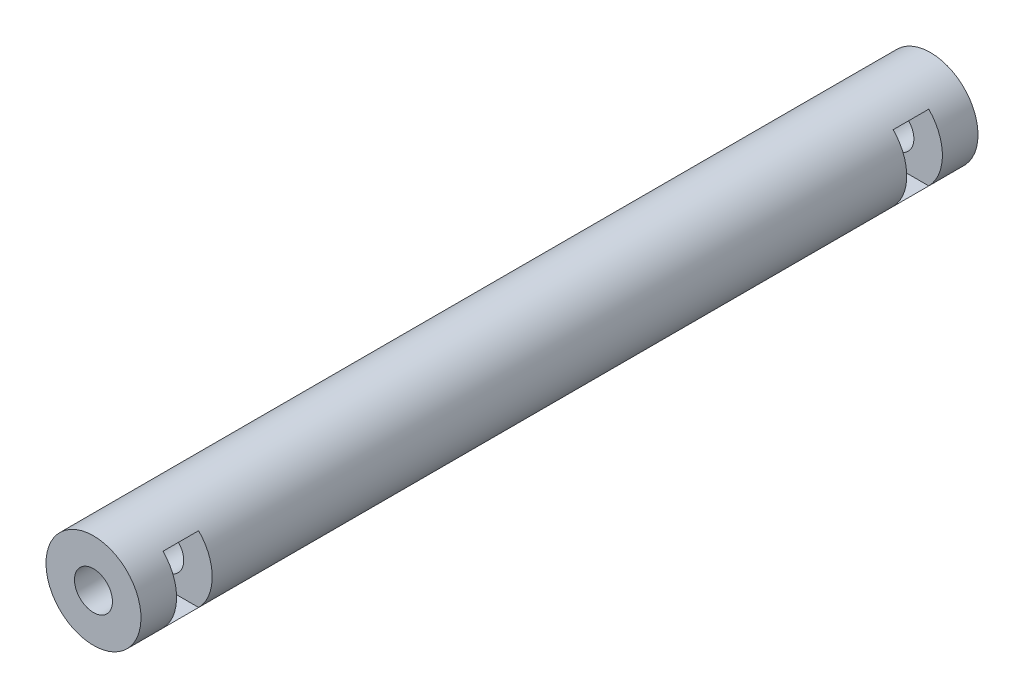
ISO-10303-21;
HEADER;
FILE_DESCRIPTION(('STEP AP214'),'2;1');
FILE_NAME('part.step','',(''),(''),'','','');
FILE_SCHEMA(('AUTOMOTIVE_DESIGN { 1 0 10303 214 1 1 1 1 }'));
ENDSEC;
DATA;
#1=APPLICATION_CONTEXT('core data for automotive mechanical design processes');
#2=APPLICATION_PROTOCOL_DEFINITION('international standard','automotive_design',2000,#1);
#3=PRODUCT_CONTEXT('',#1,'mechanical');
#4=PRODUCT('Part','Part','',(#3));
#5=PRODUCT_RELATED_PRODUCT_CATEGORY('part','',(#4));
#6=PRODUCT_DEFINITION_FORMATION('','',#4);
#7=PRODUCT_DEFINITION_CONTEXT('part definition',#1,'design');
#8=PRODUCT_DEFINITION('design','',#6,#7);
#9=PRODUCT_DEFINITION_SHAPE('','',#8);
#10=(LENGTH_UNIT() NAMED_UNIT(*) SI_UNIT(.MILLI.,.METRE.));
#11=(NAMED_UNIT(*) PLANE_ANGLE_UNIT() SI_UNIT($,.RADIAN.));
#12=(NAMED_UNIT(*) SI_UNIT($,.STERADIAN.) SOLID_ANGLE_UNIT());
#13=UNCERTAINTY_MEASURE_WITH_UNIT(LENGTH_MEASURE(1.E-05),#10,'distance_accuracy_value','');
#14=(GEOMETRIC_REPRESENTATION_CONTEXT(3) GLOBAL_UNCERTAINTY_ASSIGNED_CONTEXT((#13)) GLOBAL_UNIT_ASSIGNED_CONTEXT((#10,
#11,#12)) REPRESENTATION_CONTEXT('',''));
#15=CARTESIAN_POINT('',(0.,0.,0.));
#16=DIRECTION('',(0.,0.,1.));
#17=DIRECTION('',(1.,0.,0.));
#18=AXIS2_PLACEMENT_3D('',#15,#16,#17);
#19=CARTESIAN_POINT('',(2.,37.,70.4916798842214));
#20=DIRECTION('',(0.,0.,-1.));
#21=DIRECTION('',(-1.,0.,0.));
#22=AXIS2_PLACEMENT_3D('',#19,#20,#21);
#23=CYLINDRICAL_SURFACE('',#22,1.6);
#24=CARTESIAN_POINT('',(2.,37.,5.99999999999999));
#25=DIRECTION('',(0.,0.,1.));
#26=DIRECTION('',(1.,0.,0.));
#27=AXIS2_PLACEMENT_3D('',#24,#25,#26);
#28=CIRCLE('',#27,1.6);
#29=CARTESIAN_POINT('',(3.59999999999999,37.,5.99999999999999));
#30=VERTEX_POINT('',#29);
#31=EDGE_CURVE('E144',#30,#30,#28,.F.);
#32=ORIENTED_EDGE('',*,*,#31,.T.);
#33=EDGE_LOOP('',(#32));
#34=FACE_BOUND('',#33,.T.);
#35=CARTESIAN_POINT('',(2.,37.,64.4916798842214));
#36=DIRECTION('',(0.,0.,1.));
#37=DIRECTION('',(0.,-1.,0.));
#38=AXIS2_PLACEMENT_3D('',#35,#36,#37);
#39=CIRCLE('',#38,1.6);
#40=CARTESIAN_POINT('',(2.,35.4,64.4916798842214));
#41=VERTEX_POINT('',#40);
#42=EDGE_CURVE('E121',#41,#41,#39,.F.);
#43=ORIENTED_EDGE('',*,*,#42,.F.);
#44=EDGE_LOOP('',(#43));
#45=FACE_BOUND('',#44,.T.);
#46=ADVANCED_FACE('F33',(#34,#45),#23,.F.);
#47=CARTESIAN_POINT('',(2.,37.,70.4916798842214));
#48=DIRECTION('',(0.,0.,-1.));
#49=DIRECTION('',(-1.,0.,0.));
#50=AXIS2_PLACEMENT_3D('',#47,#48,#49);
#51=CIRCLE('',#50,1.6);
#52=CARTESIAN_POINT('',(0.400000000000001,37.,70.4916798842214));
#53=VERTEX_POINT('',#52);
#54=EDGE_CURVE('E145',#53,#53,#51,.T.);
#55=ORIENTED_EDGE('',*,*,#54,.F.);
#56=EDGE_LOOP('',(#55));
#57=FACE_BOUND('',#56,.T.);
#58=CARTESIAN_POINT('',(2.,37.,67.4916798842214));
#59=DIRECTION('',(0.,0.,-1.));
#60=DIRECTION('',(0.,1.,0.));
#61=AXIS2_PLACEMENT_3D('',#58,#59,#60);
#62=CIRCLE('',#61,1.6);
#63=CARTESIAN_POINT('',(2.,38.6,67.4916798842214));
#64=VERTEX_POINT('',#63);
#65=EDGE_CURVE('E118',#64,#64,#62,.F.);
#66=ORIENTED_EDGE('',*,*,#65,.F.);
#67=EDGE_LOOP('',(#66));
#68=FACE_BOUND('',#67,.T.);
#69=ADVANCED_FACE('F187',(#57,#68),#23,.F.);
#70=CARTESIAN_POINT('',(2.,37.,81.8053883832062));
#71=DIRECTION('',(0.,0.,-1.));
#72=DIRECTION('',(-1.,0.,0.));
#73=AXIS2_PLACEMENT_3D('',#70,#71,#72);
#74=CYLINDRICAL_SURFACE('',#73,4.);
#75=CARTESIAN_POINT('',(2.,37.,67.4916798842214));
#76=DIRECTION('',(0.,0.,-1.));
#77=DIRECTION('',(0.,1.,0.));
#78=AXIS2_PLACEMENT_3D('',#75,#76,#77);
#79=CIRCLE('',#78,4.);
#80=CARTESIAN_POINT('',(-0.856571371417151,34.2,67.4916798842214));
#81=VERTEX_POINT('',#80);
#82=CARTESIAN_POINT('',(-0.856571371417151,39.8,67.4916798842214));
#83=VERTEX_POINT('',#82);
#84=EDGE_CURVE('E106',#81,#83,#79,.T.);
#85=ORIENTED_EDGE('',*,*,#84,.F.);
#86=DIRECTION('',(0.,0.,-1.));
#87=VECTOR('',#86,1.);
#88=CARTESIAN_POINT('',(-0.856571371417151,34.2,81.8053883832062));
#89=LINE('',#88,#87);
#90=CARTESIAN_POINT('',(-0.856571371417151,34.2,64.4916798842214));
#91=VERTEX_POINT('',#90);
#92=EDGE_CURVE('E102',#91,#81,#89,.F.);
#93=ORIENTED_EDGE('',*,*,#92,.F.);
#94=CARTESIAN_POINT('',(2.,37.,64.4916798842214));
#95=DIRECTION('',(0.,0.,1.));
#96=DIRECTION('',(0.,-1.,0.));
#97=AXIS2_PLACEMENT_3D('',#94,#95,#96);
#98=CIRCLE('',#97,4.);
#99=CARTESIAN_POINT('',(-0.856571371417151,39.8,64.4916798842214));
#100=VERTEX_POINT('',#99);
#101=EDGE_CURVE('E43',#100,#91,#98,.T.);
#102=ORIENTED_EDGE('',*,*,#101,.F.);
#103=DIRECTION('',(0.,0.,-1.));
#104=VECTOR('',#103,1.);
#105=CARTESIAN_POINT('',(-0.856571371417151,39.8,81.8053883832062));
#106=LINE('',#105,#104);
#107=EDGE_CURVE('E100',#83,#100,#106,.T.);
#108=ORIENTED_EDGE('',*,*,#107,.F.);
#109=EDGE_LOOP('',(#85,#93,#102,#108));
#110=FACE_BOUND('',#109,.T.);
#111=CARTESIAN_POINT('',(2.,37.,0.));
#112=DIRECTION('',(0.,0.,1.));
#113=DIRECTION('',(1.,0.,0.));
#114=AXIS2_PLACEMENT_3D('',#111,#112,#113);
#115=CIRCLE('',#114,4.);
#116=CARTESIAN_POINT('',(6.,37.,0.));
#117=VERTEX_POINT('',#116);
#118=EDGE_CURVE('E151',#117,#117,#115,.T.);
#119=ORIENTED_EDGE('',*,*,#118,.T.);
#120=EDGE_LOOP('',(#119));
#121=FACE_BOUND('',#120,.T.);
#122=CARTESIAN_POINT('',(2.,37.,70.4916798842214));
#123=DIRECTION('',(0.,0.,-1.));
#124=DIRECTION('',(0.,1.,0.));
#125=AXIS2_PLACEMENT_3D('',#122,#123,#124);
#126=CIRCLE('',#125,4.);
#127=CARTESIAN_POINT('',(2.,41.,70.4916798842214));
#128=VERTEX_POINT('',#127);
#129=EDGE_CURVE('E154',#128,#128,#126,.T.);
#130=ORIENTED_EDGE('',*,*,#129,.T.);
#131=EDGE_LOOP('',(#130));
#132=FACE_BOUND('',#131,.T.);
#133=DIRECTION('',(0.,0.,-1.));
#134=VECTOR('',#133,1.);
#135=CARTESIAN_POINT('',(-0.856571371417151,39.8,81.8053883832062));
#136=LINE('',#135,#134);
#137=CARTESIAN_POINT('',(-0.856571371417151,39.8,3.));
#138=VERTEX_POINT('',#137);
#139=CARTESIAN_POINT('',(-0.856571371417151,39.8,6.));
#140=VERTEX_POINT('',#139);
#141=EDGE_CURVE('E170',#138,#140,#136,.F.);
#142=ORIENTED_EDGE('',*,*,#141,.T.);
#143=CARTESIAN_POINT('',(2.,37.,5.99999999999999));
#144=DIRECTION('',(0.,0.,1.));
#145=DIRECTION('',(1.,0.,0.));
#146=AXIS2_PLACEMENT_3D('',#143,#144,#145);
#147=CIRCLE('',#146,4.);
#148=CARTESIAN_POINT('',(-0.856571371417151,34.2,6.));
#149=VERTEX_POINT('',#148);
#150=EDGE_CURVE('E143',#140,#149,#147,.T.);
#151=ORIENTED_EDGE('',*,*,#150,.T.);
#152=DIRECTION('',(0.,0.,-1.));
#153=VECTOR('',#152,1.);
#154=CARTESIAN_POINT('',(-0.856571371417151,34.2,81.8053883832062));
#155=LINE('',#154,#153);
#156=CARTESIAN_POINT('',(-0.856571371417151,34.2,3.));
#157=VERTEX_POINT('',#156);
#158=EDGE_CURVE('E157',#149,#157,#155,.T.);
#159=ORIENTED_EDGE('',*,*,#158,.T.);
#160=CARTESIAN_POINT('',(2.,37.,3.));
#161=DIRECTION('',(0.,0.,-1.));
#162=DIRECTION('',(-1.,0.,0.));
#163=AXIS2_PLACEMENT_3D('',#160,#161,#162);
#164=CIRCLE('',#163,4.);
#165=EDGE_CURVE('E137',#157,#138,#164,.T.);
#166=ORIENTED_EDGE('',*,*,#165,.T.);
#167=EDGE_LOOP('',(#142,#151,#159,#166));
#168=FACE_BOUND('',#167,.T.);
#169=DIRECTION('',(0.,0.,-1.));
#170=VECTOR('',#169,1.);
#171=CARTESIAN_POINT('',(4.85657137141714,34.2,81.8053883832062));
#172=LINE('',#171,#170);
#173=CARTESIAN_POINT('',(4.85657137141714,34.2,3.));
#174=VERTEX_POINT('',#173);
#175=CARTESIAN_POINT('',(4.85657137141714,34.2,5.99999999999999));
#176=VERTEX_POINT('',#175);
#177=EDGE_CURVE('E164',#174,#176,#172,.F.);
#178=ORIENTED_EDGE('',*,*,#177,.T.);
#179=CARTESIAN_POINT('',(4.85657137141714,39.8,6.));
#180=VERTEX_POINT('',#179);
#181=EDGE_CURVE('E140',#176,#180,#147,.T.);
#182=ORIENTED_EDGE('',*,*,#181,.T.);
#183=DIRECTION('',(0.,0.,-1.));
#184=VECTOR('',#183,1.);
#185=CARTESIAN_POINT('',(4.85657137141714,39.8,81.8053883832062));
#186=LINE('',#185,#184);
#187=CARTESIAN_POINT('',(4.85657137141714,39.8,3.));
#188=VERTEX_POINT('',#187);
#189=EDGE_CURVE('E167',#180,#188,#186,.T.);
#190=ORIENTED_EDGE('',*,*,#189,.T.);
#191=EDGE_CURVE('E139',#188,#174,#164,.T.);
#192=ORIENTED_EDGE('',*,*,#191,.T.);
#193=EDGE_LOOP('',(#178,#182,#190,#192));
#194=FACE_BOUND('',#193,.T.);
#195=CARTESIAN_POINT('',(4.85657137141714,34.2,64.4916798842214));
#196=VERTEX_POINT('',#195);
#197=CARTESIAN_POINT('',(4.85657137141714,39.8,64.4916798842214));
#198=VERTEX_POINT('',#197);
#199=EDGE_CURVE('E11',#196,#198,#98,.T.);
#200=ORIENTED_EDGE('',*,*,#199,.F.);
#201=DIRECTION('',(0.,0.,-1.));
#202=VECTOR('',#201,1.);
#203=CARTESIAN_POINT('',(4.85657137141714,34.2,81.8053883832062));
#204=LINE('',#203,#202);
#205=CARTESIAN_POINT('',(4.85657137141714,34.2,67.4916798842214));
#206=VERTEX_POINT('',#205);
#207=EDGE_CURVE('E37',#206,#196,#204,.T.);
#208=ORIENTED_EDGE('',*,*,#207,.F.);
#209=CARTESIAN_POINT('',(4.85657137141714,39.8,67.4916798842214));
#210=VERTEX_POINT('',#209);
#211=EDGE_CURVE('E173',#210,#206,#79,.T.);
#212=ORIENTED_EDGE('',*,*,#211,.F.);
#213=DIRECTION('',(0.,0.,-1.));
#214=VECTOR('',#213,1.);
#215=CARTESIAN_POINT('',(4.85657137141714,39.8,81.8053883832062));
#216=LINE('',#215,#214);
#217=EDGE_CURVE('E175',#198,#210,#216,.F.);
#218=ORIENTED_EDGE('',*,*,#217,.F.);
#219=EDGE_LOOP('',(#200,#208,#212,#218));
#220=FACE_BOUND('',#219,.T.);
#221=ADVANCED_FACE('F35',(#110,#121,#132,#168,#194,#220),#74,.T.);
#222=CARTESIAN_POINT('',(2.,37.,0.));
#223=DIRECTION('',(0.,0.,1.));
#224=DIRECTION('',(1.,0.,0.));
#225=AXIS2_PLACEMENT_3D('',#222,#223,#224);
#226=PLANE('',#225);
#227=CARTESIAN_POINT('',(2.,37.,0.));
#228=DIRECTION('',(0.,0.,1.));
#229=DIRECTION('',(1.,0.,0.));
#230=AXIS2_PLACEMENT_3D('',#227,#228,#229);
#231=CIRCLE('',#230,1.6);
#232=CARTESIAN_POINT('',(3.59999999999999,37.,0.));
#233=VERTEX_POINT('',#232);
#234=EDGE_CURVE('E148',#233,#233,#231,.T.);
#235=ORIENTED_EDGE('',*,*,#234,.T.);
#236=EDGE_LOOP('',(#235));
#237=FACE_BOUND('',#236,.T.);
#238=ORIENTED_EDGE('',*,*,#118,.F.);
#239=EDGE_LOOP('',(#238));
#240=FACE_BOUND('',#239,.T.);
#241=ADVANCED_FACE('F186',(#237,#240),#226,.F.);
#242=CARTESIAN_POINT('',(0.,0.,70.4916798842214));
#243=DIRECTION('',(0.,0.,-1.));
#244=DIRECTION('',(-1.,0.,0.));
#245=AXIS2_PLACEMENT_3D('',#242,#243,#244);
#246=PLANE('',#245);
#247=ORIENTED_EDGE('',*,*,#54,.T.);
#248=EDGE_LOOP('',(#247));
#249=FACE_BOUND('',#248,.T.);
#250=ORIENTED_EDGE('',*,*,#129,.F.);
#251=EDGE_LOOP('',(#250));
#252=FACE_BOUND('',#251,.T.);
#253=ADVANCED_FACE('F192',(#249,#252),#246,.F.);
#254=CARTESIAN_POINT('',(2.,37.,3.));
#255=DIRECTION('',(0.,0.,-1.));
#256=DIRECTION('',(-1.,0.,0.));
#257=AXIS2_PLACEMENT_3D('',#254,#255,#256);
#258=CIRCLE('',#257,1.6);
#259=CARTESIAN_POINT('',(0.400000000000001,37.,3.));
#260=VERTEX_POINT('',#259);
#261=EDGE_CURVE('E129',#260,#260,#258,.F.);
#262=ORIENTED_EDGE('',*,*,#261,.T.);
#263=EDGE_LOOP('',(#262));
#264=FACE_BOUND('',#263,.T.);
#265=ORIENTED_EDGE('',*,*,#234,.F.);
#266=EDGE_LOOP('',(#265));
#267=FACE_BOUND('',#266,.T.);
#268=ADVANCED_FACE('F196',(#264,#267),#23,.F.);
#269=CARTESIAN_POINT('',(-2.00000000000001,39.8,6.));
#270=DIRECTION('',(0.,1.,0.));
#271=DIRECTION('',(0.,0.,1.));
#272=AXIS2_PLACEMENT_3D('',#269,#270,#271);
#273=PLANE('',#272);
#274=DIRECTION('',(1.,0.,0.));
#275=VECTOR('',#274,1.);
#276=CARTESIAN_POINT('',(-2.00000000000001,39.8,6.));
#277=LINE('',#276,#275);
#278=EDGE_CURVE('E126',#140,#180,#277,.T.);
#279=ORIENTED_EDGE('',*,*,#278,.F.);
#280=ORIENTED_EDGE('',*,*,#141,.F.);
#281=DIRECTION('',(1.,0.,0.));
#282=VECTOR('',#281,1.);
#283=CARTESIAN_POINT('',(-2.00000000000001,39.8,3.));
#284=LINE('',#283,#282);
#285=EDGE_CURVE('E130',#138,#188,#284,.T.);
#286=ORIENTED_EDGE('',*,*,#285,.T.);
#287=ORIENTED_EDGE('',*,*,#189,.F.);
#288=EDGE_LOOP('',(#279,#280,#286,#287));
#289=FACE_BOUND('',#288,.T.);
#290=ADVANCED_FACE('F205',(#289),#273,.F.);
#291=CARTESIAN_POINT('',(-2.00000000000001,34.2,6.));
#292=DIRECTION('',(0.,-1.,0.));
#293=DIRECTION('',(0.,0.,-1.));
#294=AXIS2_PLACEMENT_3D('',#291,#292,#293);
#295=PLANE('',#294);
#296=DIRECTION('',(1.,0.,0.));
#297=VECTOR('',#296,1.);
#298=CARTESIAN_POINT('',(-2.00000000000001,34.2,6.));
#299=LINE('',#298,#297);
#300=EDGE_CURVE('E125',#149,#176,#299,.T.);
#301=ORIENTED_EDGE('',*,*,#300,.T.);
#302=ORIENTED_EDGE('',*,*,#177,.F.);
#303=DIRECTION('',(1.,0.,0.));
#304=VECTOR('',#303,1.);
#305=CARTESIAN_POINT('',(-2.00000000000001,34.2,3.));
#306=LINE('',#305,#304);
#307=EDGE_CURVE('E133',#157,#174,#306,.T.);
#308=ORIENTED_EDGE('',*,*,#307,.F.);
#309=ORIENTED_EDGE('',*,*,#158,.F.);
#310=EDGE_LOOP('',(#301,#302,#308,#309));
#311=FACE_BOUND('',#310,.T.);
#312=ADVANCED_FACE('F211',(#311),#295,.F.);
#313=CARTESIAN_POINT('',(-2.00000000000001,39.8,6.));
#314=DIRECTION('',(0.,0.,1.));
#315=DIRECTION('',(1.,0.,0.));
#316=AXIS2_PLACEMENT_3D('',#313,#314,#315);
#317=PLANE('',#316);
#318=ORIENTED_EDGE('',*,*,#31,.F.);
#319=EDGE_LOOP('',(#318));
#320=FACE_BOUND('',#319,.T.);
#321=ORIENTED_EDGE('',*,*,#278,.T.);
#322=ORIENTED_EDGE('',*,*,#181,.F.);
#323=ORIENTED_EDGE('',*,*,#300,.F.);
#324=ORIENTED_EDGE('',*,*,#150,.F.);
#325=EDGE_LOOP('',(#321,#322,#323,#324));
#326=FACE_BOUND('',#325,.T.);
#327=ADVANCED_FACE('F235',(#320,#326),#317,.F.);
#328=CARTESIAN_POINT('',(-2.00000000000001,39.8,3.));
#329=DIRECTION('',(0.,0.,-1.));
#330=DIRECTION('',(-1.,0.,0.));
#331=AXIS2_PLACEMENT_3D('',#328,#329,#330);
#332=PLANE('',#331);
#333=ORIENTED_EDGE('',*,*,#261,.F.);
#334=EDGE_LOOP('',(#333));
#335=FACE_BOUND('',#334,.T.);
#336=ORIENTED_EDGE('',*,*,#285,.F.);
#337=ORIENTED_EDGE('',*,*,#165,.F.);
#338=ORIENTED_EDGE('',*,*,#307,.T.);
#339=ORIENTED_EDGE('',*,*,#191,.F.);
#340=EDGE_LOOP('',(#336,#337,#338,#339));
#341=FACE_BOUND('',#340,.T.);
#342=ADVANCED_FACE('F233',(#335,#341),#332,.F.);
#343=CARTESIAN_POINT('',(-2.00000000000001,39.8,64.4916798842214));
#344=DIRECTION('',(0.,0.,1.));
#345=DIRECTION('',(0.,-1.,0.));
#346=AXIS2_PLACEMENT_3D('',#343,#344,#345);
#347=PLANE('',#346);
#348=ORIENTED_EDGE('',*,*,#199,.T.);
#349=DIRECTION('',(1.,0.,0.));
#350=VECTOR('',#349,1.);
#351=CARTESIAN_POINT('',(-2.00000000000001,39.8,64.4916798842214));
#352=LINE('',#351,#350);
#353=EDGE_CURVE('E50',#100,#198,#352,.T.);
#354=ORIENTED_EDGE('',*,*,#353,.F.);
#355=ORIENTED_EDGE('',*,*,#101,.T.);
#356=DIRECTION('',(1.,0.,0.));
#357=VECTOR('',#356,1.);
#358=CARTESIAN_POINT('',(-2.00000000000001,34.2,64.4916798842214));
#359=LINE('',#358,#357);
#360=EDGE_CURVE('E122',#91,#196,#359,.T.);
#361=ORIENTED_EDGE('',*,*,#360,.T.);
#362=EDGE_LOOP('',(#348,#354,#355,#361));
#363=FACE_BOUND('',#362,.T.);
#364=ORIENTED_EDGE('',*,*,#42,.T.);
#365=EDGE_LOOP('',(#364));
#366=FACE_BOUND('',#365,.T.);
#367=ADVANCED_FACE('F109',(#363,#366),#347,.T.);
#368=CARTESIAN_POINT('',(-2.00000000000001,34.2,64.4916798842214));
#369=DIRECTION('',(0.,1.,0.));
#370=DIRECTION('',(0.,0.,1.));
#371=AXIS2_PLACEMENT_3D('',#368,#369,#370);
#372=PLANE('',#371);
#373=ORIENTED_EDGE('',*,*,#207,.T.);
#374=ORIENTED_EDGE('',*,*,#360,.F.);
#375=ORIENTED_EDGE('',*,*,#92,.T.);
#376=DIRECTION('',(1.,0.,0.));
#377=VECTOR('',#376,1.);
#378=CARTESIAN_POINT('',(-2.00000000000001,34.2,67.4916798842214));
#379=LINE('',#378,#377);
#380=EDGE_CURVE('E114',#81,#206,#379,.T.);
#381=ORIENTED_EDGE('',*,*,#380,.T.);
#382=EDGE_LOOP('',(#373,#374,#375,#381));
#383=FACE_BOUND('',#382,.T.);
#384=ADVANCED_FACE('F182',(#383),#372,.T.);
#385=CARTESIAN_POINT('',(-2.00000000000001,39.8,67.4916798842214));
#386=DIRECTION('',(0.,0.,-1.));
#387=DIRECTION('',(0.,1.,0.));
#388=AXIS2_PLACEMENT_3D('',#385,#386,#387);
#389=PLANE('',#388);
#390=ORIENTED_EDGE('',*,*,#211,.T.);
#391=ORIENTED_EDGE('',*,*,#380,.F.);
#392=ORIENTED_EDGE('',*,*,#84,.T.);
#393=DIRECTION('',(1.,0.,0.));
#394=VECTOR('',#393,1.);
#395=CARTESIAN_POINT('',(-2.00000000000001,39.8,67.4916798842214));
#396=LINE('',#395,#394);
#397=EDGE_CURVE('E54',#83,#210,#396,.T.);
#398=ORIENTED_EDGE('',*,*,#397,.T.);
#399=EDGE_LOOP('',(#390,#391,#392,#398));
#400=FACE_BOUND('',#399,.T.);
#401=ORIENTED_EDGE('',*,*,#65,.T.);
#402=EDGE_LOOP('',(#401));
#403=FACE_BOUND('',#402,.T.);
#404=ADVANCED_FACE('F252',(#400,#403),#389,.T.);
#405=CARTESIAN_POINT('',(-2.00000000000001,39.8,64.4916798842214));
#406=DIRECTION('',(0.,-1.,0.));
#407=DIRECTION('',(0.,0.,-1.));
#408=AXIS2_PLACEMENT_3D('',#405,#406,#407);
#409=PLANE('',#408);
#410=ORIENTED_EDGE('',*,*,#107,.T.);
#411=ORIENTED_EDGE('',*,*,#353,.T.);
#412=ORIENTED_EDGE('',*,*,#217,.T.);
#413=ORIENTED_EDGE('',*,*,#397,.F.);
#414=EDGE_LOOP('',(#410,#411,#412,#413));
#415=FACE_BOUND('',#414,.T.);
#416=ADVANCED_FACE('F107',(#415),#409,.T.);
#417=CLOSED_SHELL('',(#46,#69,#221,#241,#253,#268,#290,#312,#327,#342,#367,#384,#404,#416));
#418=MANIFOLD_SOLID_BREP('B2',#417);
#419=ADVANCED_BREP_SHAPE_REPRESENTATION('',(#18,#418),#14);
#420=SHAPE_DEFINITION_REPRESENTATION(#9,#419);
ENDSEC;
END-ISO-10303-21;
